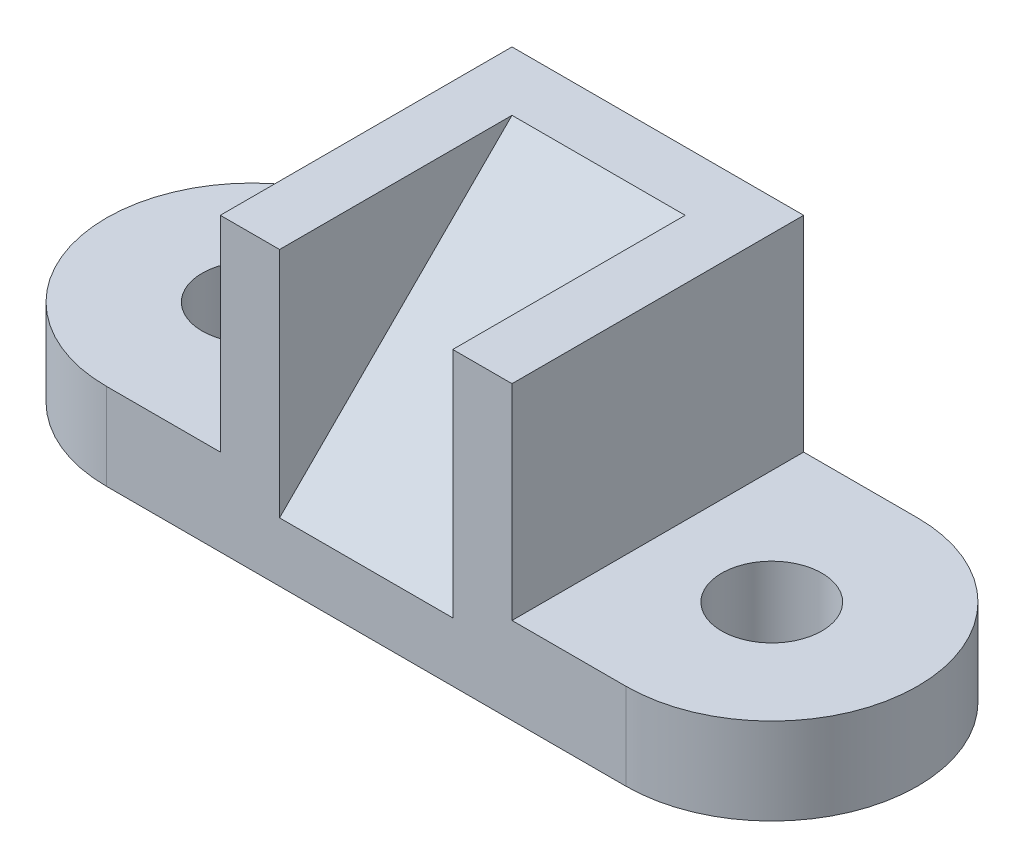
ISO-10303-21;
HEADER;
FILE_DESCRIPTION(('STEP AP214'),'2;1');
FILE_NAME('part.step','',(''),(''),'','','');
FILE_SCHEMA(('AUTOMOTIVE_DESIGN { 1 0 10303 214 1 1 1 1 }'));
ENDSEC;
DATA;
#1=APPLICATION_CONTEXT('core data for automotive mechanical design processes');
#2=APPLICATION_PROTOCOL_DEFINITION('international standard','automotive_design',2000,#1);
#3=PRODUCT_CONTEXT('',#1,'mechanical');
#4=PRODUCT('Part','Part','',(#3));
#5=PRODUCT_RELATED_PRODUCT_CATEGORY('part','',(#4));
#6=PRODUCT_DEFINITION_FORMATION('','',#4);
#7=PRODUCT_DEFINITION_CONTEXT('part definition',#1,'design');
#8=PRODUCT_DEFINITION('design','',#6,#7);
#9=PRODUCT_DEFINITION_SHAPE('','',#8);
#10=(LENGTH_UNIT() NAMED_UNIT(*) SI_UNIT(.MILLI.,.METRE.));
#11=(NAMED_UNIT(*) PLANE_ANGLE_UNIT() SI_UNIT($,.RADIAN.));
#12=(NAMED_UNIT(*) SI_UNIT($,.STERADIAN.) SOLID_ANGLE_UNIT());
#13=UNCERTAINTY_MEASURE_WITH_UNIT(LENGTH_MEASURE(1.E-05),#10,'distance_accuracy_value','');
#14=(GEOMETRIC_REPRESENTATION_CONTEXT(3) GLOBAL_UNCERTAINTY_ASSIGNED_CONTEXT((#13)) GLOBAL_UNIT_ASSIGNED_CONTEXT((#10,
#11,#12)) REPRESENTATION_CONTEXT('',''));
#15=CARTESIAN_POINT('',(0.,0.,0.));
#16=DIRECTION('',(0.,0.,1.));
#17=DIRECTION('',(1.,0.,0.));
#18=AXIS2_PLACEMENT_3D('',#15,#16,#17);
#19=CARTESIAN_POINT('',(0.,19.,0.));
#20=DIRECTION('',(0.,0.,-1.));
#21=DIRECTION('',(-1.,0.,0.));
#22=AXIS2_PLACEMENT_3D('',#19,#20,#21);
#23=PLANE('',#22);
#24=DIRECTION('',(0.,1.,0.));
#25=VECTOR('',#24,1.);
#26=CARTESIAN_POINT('',(76.,13.,0.));
#27=LINE('',#26,#25);
#28=CARTESIAN_POINT('',(76.,13.,0.));
#29=VERTEX_POINT('',#28);
#30=CARTESIAN_POINT('',(76.,64.,0.));
#31=VERTEX_POINT('',#30);
#32=EDGE_CURVE('E132',#29,#31,#27,.T.);
#33=ORIENTED_EDGE('',*,*,#32,.F.);
#34=DIRECTION('',(-1.,0.,0.));
#35=VECTOR('',#34,1.);
#36=CARTESIAN_POINT('',(76.,13.,0.));
#37=LINE('',#36,#35);
#38=CARTESIAN_POINT('',(38.,13.,0.));
#39=VERTEX_POINT('',#38);
#40=EDGE_CURVE('E119',#29,#39,#37,.T.);
#41=ORIENTED_EDGE('',*,*,#40,.T.);
#42=DIRECTION('',(0.,1.,0.));
#43=VECTOR('',#42,1.);
#44=CARTESIAN_POINT('',(38.,13.,0.));
#45=LINE('',#44,#43);
#46=CARTESIAN_POINT('',(38.,64.,0.));
#47=VERTEX_POINT('',#46);
#48=EDGE_CURVE('E144',#39,#47,#45,.T.);
#49=ORIENTED_EDGE('',*,*,#48,.T.);
#50=DIRECTION('',(1.,0.,0.));
#51=VECTOR('',#50,1.);
#52=CARTESIAN_POINT('',(89.,64.,0.));
#53=LINE('',#52,#51);
#54=CARTESIAN_POINT('',(25.,64.,0.));
#55=VERTEX_POINT('',#54);
#56=EDGE_CURVE('E153',#55,#47,#53,.T.);
#57=ORIENTED_EDGE('',*,*,#56,.F.);
#58=DIRECTION('',(0.,-1.,0.));
#59=VECTOR('',#58,1.);
#60=CARTESIAN_POINT('',(25.,64.,0.));
#61=LINE('',#60,#59);
#62=CARTESIAN_POINT('',(25.,19.,0.));
#63=VERTEX_POINT('',#62);
#64=EDGE_CURVE('E172',#55,#63,#61,.T.);
#65=ORIENTED_EDGE('',*,*,#64,.T.);
#66=DIRECTION('',(1.,0.,0.));
#67=VECTOR('',#66,1.);
#68=CARTESIAN_POINT('',(0.,19.,0.));
#69=LINE('',#68,#67);
#70=CARTESIAN_POINT('',(0.,19.,0.));
#71=VERTEX_POINT('',#70);
#72=EDGE_CURVE('E193',#71,#63,#69,.T.);
#73=ORIENTED_EDGE('',*,*,#72,.F.);
#74=DIRECTION('',(0.,-1.,0.));
#75=VECTOR('',#74,1.);
#76=CARTESIAN_POINT('',(0.,19.,0.));
#77=LINE('',#76,#75);
#78=CARTESIAN_POINT('',(0.,0.,0.));
#79=VERTEX_POINT('',#78);
#80=EDGE_CURVE('E11',#71,#79,#77,.T.);
#81=ORIENTED_EDGE('',*,*,#80,.T.);
#82=DIRECTION('',(1.,0.,0.));
#83=VECTOR('',#82,1.);
#84=CARTESIAN_POINT('',(0.,0.,0.));
#85=LINE('',#84,#83);
#86=CARTESIAN_POINT('',(114.,0.,0.));
#87=VERTEX_POINT('',#86);
#88=EDGE_CURVE('E203',#79,#87,#85,.T.);
#89=ORIENTED_EDGE('',*,*,#88,.T.);
#90=DIRECTION('',(0.,-1.,0.));
#91=VECTOR('',#90,1.);
#92=CARTESIAN_POINT('',(114.,19.,0.));
#93=LINE('',#92,#91);
#94=CARTESIAN_POINT('',(114.,19.,0.));
#95=VERTEX_POINT('',#94);
#96=EDGE_CURVE('E45',#95,#87,#93,.T.);
#97=ORIENTED_EDGE('',*,*,#96,.F.);
#98=CARTESIAN_POINT('',(89.,19.,0.));
#99=VERTEX_POINT('',#98);
#100=EDGE_CURVE('E191',#99,#95,#69,.T.);
#101=ORIENTED_EDGE('',*,*,#100,.F.);
#102=DIRECTION('',(0.,-1.,0.));
#103=VECTOR('',#102,1.);
#104=CARTESIAN_POINT('',(89.,64.,0.));
#105=LINE('',#104,#103);
#106=CARTESIAN_POINT('',(89.,64.,0.));
#107=VERTEX_POINT('',#106);
#108=EDGE_CURVE('E169',#107,#99,#105,.T.);
#109=ORIENTED_EDGE('',*,*,#108,.F.);
#110=EDGE_CURVE('E139',#31,#107,#53,.T.);
#111=ORIENTED_EDGE('',*,*,#110,.F.);
#112=EDGE_LOOP('',(#33,#41,#49,#57,#65,#73,#81,#89,#97,#101,#109,#111));
#113=FACE_BOUND('',#112,.T.);
#114=ADVANCED_FACE('F37',(#113),#23,.F.);
#115=CARTESIAN_POINT('',(0.,64.,0.));
#116=DIRECTION('',(0.,-1.,0.));
#117=DIRECTION('',(0.,0.,-1.));
#118=AXIS2_PLACEMENT_3D('',#115,#116,#117);
#119=PLANE('',#118);
#120=DIRECTION('',(0.,0.,-1.));
#121=VECTOR('',#120,1.);
#122=CARTESIAN_POINT('',(76.,64.,0.));
#123=LINE('',#122,#121);
#124=CARTESIAN_POINT('',(76.,64.,-51.));
#125=VERTEX_POINT('',#124);
#126=EDGE_CURVE('E128',#31,#125,#123,.T.);
#127=ORIENTED_EDGE('',*,*,#126,.F.);
#128=ORIENTED_EDGE('',*,*,#110,.T.);
#129=DIRECTION('',(0.,0.,-1.));
#130=VECTOR('',#129,1.);
#131=CARTESIAN_POINT('',(89.,64.,-64.));
#132=LINE('',#131,#130);
#133=CARTESIAN_POINT('',(89.,64.,-64.));
#134=VERTEX_POINT('',#133);
#135=EDGE_CURVE('E156',#107,#134,#132,.T.);
#136=ORIENTED_EDGE('',*,*,#135,.T.);
#137=DIRECTION('',(-1.,0.,0.));
#138=VECTOR('',#137,1.);
#139=CARTESIAN_POINT('',(89.,64.,-64.));
#140=LINE('',#139,#138);
#141=CARTESIAN_POINT('',(25.,64.,-64.));
#142=VERTEX_POINT('',#141);
#143=EDGE_CURVE('E158',#134,#142,#140,.T.);
#144=ORIENTED_EDGE('',*,*,#143,.T.);
#145=DIRECTION('',(0.,0.,1.));
#146=VECTOR('',#145,1.);
#147=CARTESIAN_POINT('',(25.,64.,-64.));
#148=LINE('',#147,#146);
#149=EDGE_CURVE('E149',#142,#55,#148,.T.);
#150=ORIENTED_EDGE('',*,*,#149,.T.);
#151=ORIENTED_EDGE('',*,*,#56,.T.);
#152=DIRECTION('',(0.,0.,-1.));
#153=VECTOR('',#152,1.);
#154=CARTESIAN_POINT('',(38.,64.,0.));
#155=LINE('',#154,#153);
#156=CARTESIAN_POINT('',(38.,64.,-51.));
#157=VERTEX_POINT('',#156);
#158=EDGE_CURVE('E135',#47,#157,#155,.T.);
#159=ORIENTED_EDGE('',*,*,#158,.T.);
#160=DIRECTION('',(-1.,0.,0.));
#161=VECTOR('',#160,1.);
#162=CARTESIAN_POINT('',(76.,64.,-51.));
#163=LINE('',#162,#161);
#164=EDGE_CURVE('E127',#125,#157,#163,.T.);
#165=ORIENTED_EDGE('',*,*,#164,.F.);
#166=EDGE_LOOP('',(#127,#128,#136,#144,#150,#151,#159,#165));
#167=FACE_BOUND('',#166,.T.);
#168=ADVANCED_FACE('F241',(#167),#119,.F.);
#169=CARTESIAN_POINT('',(0.,19.,-32.));
#170=DIRECTION('',(0.,1.,0.));
#171=DIRECTION('',(0.,0.,1.));
#172=AXIS2_PLACEMENT_3D('',#169,#170,#171);
#173=PLANE('',#172);
#174=DIRECTION('',(0.,0.,1.));
#175=VECTOR('',#174,1.);
#176=CARTESIAN_POINT('',(25.,19.,-64.));
#177=LINE('',#176,#175);
#178=CARTESIAN_POINT('',(25.,19.,-64.));
#179=VERTEX_POINT('',#178);
#180=EDGE_CURVE('E60',#179,#63,#177,.T.);
#181=ORIENTED_EDGE('',*,*,#180,.F.);
#182=DIRECTION('',(-1.,0.,0.));
#183=VECTOR('',#182,1.);
#184=CARTESIAN_POINT('',(0.,19.,-64.));
#185=LINE('',#184,#183);
#186=CARTESIAN_POINT('',(0.,19.,-64.));
#187=VERTEX_POINT('',#186);
#188=EDGE_CURVE('E197',#179,#187,#185,.T.);
#189=ORIENTED_EDGE('',*,*,#188,.T.);
#190=CARTESIAN_POINT('',(0.,19.,-32.));
#191=DIRECTION('',(0.,1.,0.));
#192=DIRECTION('',(0.,0.,1.));
#193=AXIS2_PLACEMENT_3D('',#190,#191,#192);
#194=CIRCLE('',#193,32.);
#195=EDGE_CURVE('E188',#187,#71,#194,.T.);
#196=ORIENTED_EDGE('',*,*,#195,.T.);
#197=ORIENTED_EDGE('',*,*,#72,.T.);
#198=EDGE_LOOP('',(#181,#189,#196,#197));
#199=FACE_BOUND('',#198,.T.);
#200=CARTESIAN_POINT('',(0.,19.,-32.));
#201=DIRECTION('',(0.,1.,0.));
#202=DIRECTION('',(0.,0.,1.));
#203=AXIS2_PLACEMENT_3D('',#200,#201,#202);
#204=CIRCLE('',#203,11.);
#205=CARTESIAN_POINT('',(0.,19.,-21.));
#206=VERTEX_POINT('',#205);
#207=EDGE_CURVE('E182',#206,#206,#204,.T.);
#208=ORIENTED_EDGE('',*,*,#207,.F.);
#209=EDGE_LOOP('',(#208));
#210=FACE_BOUND('',#209,.T.);
#211=ADVANCED_FACE('F232',(#199,#210),#173,.T.);
#212=DIRECTION('',(0.,0.,-1.));
#213=VECTOR('',#212,1.);
#214=CARTESIAN_POINT('',(89.,19.,-64.));
#215=LINE('',#214,#213);
#216=CARTESIAN_POINT('',(89.,19.,-64.));
#217=VERTEX_POINT('',#216);
#218=EDGE_CURVE('E152',#99,#217,#215,.T.);
#219=ORIENTED_EDGE('',*,*,#218,.F.);
#220=ORIENTED_EDGE('',*,*,#100,.T.);
#221=CARTESIAN_POINT('',(114.,19.,-32.));
#222=DIRECTION('',(0.,1.,0.));
#223=DIRECTION('',(0.,0.,1.));
#224=AXIS2_PLACEMENT_3D('',#221,#222,#223);
#225=CIRCLE('',#224,32.);
#226=CARTESIAN_POINT('',(114.,19.,-64.));
#227=VERTEX_POINT('',#226);
#228=EDGE_CURVE('E195',#95,#227,#225,.T.);
#229=ORIENTED_EDGE('',*,*,#228,.T.);
#230=EDGE_CURVE('E198',#227,#217,#185,.T.);
#231=ORIENTED_EDGE('',*,*,#230,.T.);
#232=EDGE_LOOP('',(#219,#220,#229,#231));
#233=FACE_BOUND('',#232,.T.);
#234=CARTESIAN_POINT('',(114.,19.,-32.));
#235=DIRECTION('',(0.,1.,0.));
#236=DIRECTION('',(0.,0.,1.));
#237=AXIS2_PLACEMENT_3D('',#234,#235,#236);
#238=CIRCLE('',#237,11.);
#239=CARTESIAN_POINT('',(114.,19.,-21.));
#240=VERTEX_POINT('',#239);
#241=EDGE_CURVE('E176',#240,#240,#238,.T.);
#242=ORIENTED_EDGE('',*,*,#241,.F.);
#243=EDGE_LOOP('',(#242));
#244=FACE_BOUND('',#243,.T.);
#245=ADVANCED_FACE('F247',(#233,#244),#173,.T.);
#246=CARTESIAN_POINT('',(0.,0.,-32.));
#247=DIRECTION('',(0.,1.,0.));
#248=DIRECTION('',(0.,0.,1.));
#249=AXIS2_PLACEMENT_3D('',#246,#247,#248);
#250=PLANE('',#249);
#251=CARTESIAN_POINT('',(0.,0.,-32.));
#252=DIRECTION('',(0.,1.,0.));
#253=DIRECTION('',(0.,0.,1.));
#254=AXIS2_PLACEMENT_3D('',#251,#252,#253);
#255=CIRCLE('',#254,32.);
#256=CARTESIAN_POINT('',(0.,0.,-64.));
#257=VERTEX_POINT('',#256);
#258=EDGE_CURVE('E185',#257,#79,#255,.T.);
#259=ORIENTED_EDGE('',*,*,#258,.F.);
#260=DIRECTION('',(-1.,0.,0.));
#261=VECTOR('',#260,1.);
#262=CARTESIAN_POINT('',(0.,0.,-64.));
#263=LINE('',#262,#261);
#264=CARTESIAN_POINT('',(114.,0.,-64.));
#265=VERTEX_POINT('',#264);
#266=EDGE_CURVE('E192',#265,#257,#263,.T.);
#267=ORIENTED_EDGE('',*,*,#266,.F.);
#268=CARTESIAN_POINT('',(114.,0.,-32.));
#269=DIRECTION('',(0.,1.,0.));
#270=DIRECTION('',(0.,0.,1.));
#271=AXIS2_PLACEMENT_3D('',#268,#269,#270);
#272=CIRCLE('',#271,32.);
#273=EDGE_CURVE('E205',#87,#265,#272,.T.);
#274=ORIENTED_EDGE('',*,*,#273,.F.);
#275=ORIENTED_EDGE('',*,*,#88,.F.);
#276=EDGE_LOOP('',(#259,#267,#274,#275));
#277=FACE_BOUND('',#276,.T.);
#278=CARTESIAN_POINT('',(0.,0.,-32.));
#279=DIRECTION('',(0.,1.,0.));
#280=DIRECTION('',(0.,0.,1.));
#281=AXIS2_PLACEMENT_3D('',#278,#279,#280);
#282=CIRCLE('',#281,11.);
#283=CARTESIAN_POINT('',(0.,0.,-21.));
#284=VERTEX_POINT('',#283);
#285=EDGE_CURVE('E179',#284,#284,#282,.T.);
#286=ORIENTED_EDGE('',*,*,#285,.T.);
#287=EDGE_LOOP('',(#286));
#288=FACE_BOUND('',#287,.T.);
#289=CARTESIAN_POINT('',(114.,0.,-32.));
#290=DIRECTION('',(0.,1.,0.));
#291=DIRECTION('',(0.,0.,1.));
#292=AXIS2_PLACEMENT_3D('',#289,#290,#291);
#293=CIRCLE('',#292,11.);
#294=CARTESIAN_POINT('',(114.,0.,-21.));
#295=VERTEX_POINT('',#294);
#296=EDGE_CURVE('E175',#295,#295,#293,.T.);
#297=ORIENTED_EDGE('',*,*,#296,.T.);
#298=EDGE_LOOP('',(#297));
#299=FACE_BOUND('',#298,.T.);
#300=ADVANCED_FACE('F223',(#277,#288,#299),#250,.F.);
#301=CARTESIAN_POINT('',(0.,19.,-32.));
#302=DIRECTION('',(0.,-1.,0.));
#303=DIRECTION('',(0.,0.,-1.));
#304=AXIS2_PLACEMENT_3D('',#301,#302,#303);
#305=CYLINDRICAL_SURFACE('',#304,32.);
#306=ORIENTED_EDGE('',*,*,#258,.T.);
#307=ORIENTED_EDGE('',*,*,#80,.F.);
#308=ORIENTED_EDGE('',*,*,#195,.F.);
#309=DIRECTION('',(0.,-1.,0.));
#310=VECTOR('',#309,1.);
#311=CARTESIAN_POINT('',(0.,19.,-64.));
#312=LINE('',#311,#310);
#313=EDGE_CURVE('E200',#187,#257,#312,.T.);
#314=ORIENTED_EDGE('',*,*,#313,.T.);
#315=EDGE_LOOP('',(#306,#307,#308,#314));
#316=FACE_BOUND('',#315,.T.);
#317=ADVANCED_FACE('F39',(#316),#305,.T.);
#318=CARTESIAN_POINT('',(114.,19.,-32.));
#319=DIRECTION('',(0.,-1.,0.));
#320=DIRECTION('',(0.,0.,-1.));
#321=AXIS2_PLACEMENT_3D('',#318,#319,#320);
#322=CYLINDRICAL_SURFACE('',#321,32.);
#323=ORIENTED_EDGE('',*,*,#273,.T.);
#324=DIRECTION('',(0.,-1.,0.));
#325=VECTOR('',#324,1.);
#326=CARTESIAN_POINT('',(114.,19.,-64.));
#327=LINE('',#326,#325);
#328=EDGE_CURVE('E210',#227,#265,#327,.T.);
#329=ORIENTED_EDGE('',*,*,#328,.F.);
#330=ORIENTED_EDGE('',*,*,#228,.F.);
#331=ORIENTED_EDGE('',*,*,#96,.T.);
#332=EDGE_LOOP('',(#323,#329,#330,#331));
#333=FACE_BOUND('',#332,.T.);
#334=ADVANCED_FACE('F217',(#333),#322,.T.);
#335=CARTESIAN_POINT('',(0.,19.,-64.));
#336=DIRECTION('',(0.,0.,1.));
#337=DIRECTION('',(1.,0.,0.));
#338=AXIS2_PLACEMENT_3D('',#335,#336,#337);
#339=PLANE('',#338);
#340=ORIENTED_EDGE('',*,*,#266,.T.);
#341=ORIENTED_EDGE('',*,*,#313,.F.);
#342=ORIENTED_EDGE('',*,*,#188,.F.);
#343=DIRECTION('',(0.,-1.,0.));
#344=VECTOR('',#343,1.);
#345=CARTESIAN_POINT('',(25.,64.,-64.));
#346=LINE('',#345,#344);
#347=EDGE_CURVE('E160',#142,#179,#346,.T.);
#348=ORIENTED_EDGE('',*,*,#347,.F.);
#349=ORIENTED_EDGE('',*,*,#143,.F.);
#350=DIRECTION('',(0.,-1.,0.));
#351=VECTOR('',#350,1.);
#352=CARTESIAN_POINT('',(89.,64.,-64.));
#353=LINE('',#352,#351);
#354=EDGE_CURVE('E166',#134,#217,#353,.T.);
#355=ORIENTED_EDGE('',*,*,#354,.T.);
#356=ORIENTED_EDGE('',*,*,#230,.F.);
#357=ORIENTED_EDGE('',*,*,#328,.T.);
#358=EDGE_LOOP('',(#340,#341,#342,#348,#349,#355,#356,#357));
#359=FACE_BOUND('',#358,.T.);
#360=ADVANCED_FACE('F227',(#359),#339,.F.);
#361=CARTESIAN_POINT('',(0.,19.,-32.));
#362=DIRECTION('',(0.,-1.,0.));
#363=DIRECTION('',(0.,0.,-1.));
#364=AXIS2_PLACEMENT_3D('',#361,#362,#363);
#365=CYLINDRICAL_SURFACE('',#364,11.);
#366=ORIENTED_EDGE('',*,*,#207,.T.);
#367=EDGE_LOOP('',(#366));
#368=FACE_BOUND('',#367,.T.);
#369=ORIENTED_EDGE('',*,*,#285,.F.);
#370=EDGE_LOOP('',(#369));
#371=FACE_BOUND('',#370,.T.);
#372=ADVANCED_FACE('F256',(#368,#371),#365,.F.);
#373=CARTESIAN_POINT('',(114.,19.,-32.));
#374=DIRECTION('',(0.,-1.,0.));
#375=DIRECTION('',(0.,0.,-1.));
#376=AXIS2_PLACEMENT_3D('',#373,#374,#375);
#377=CYLINDRICAL_SURFACE('',#376,11.);
#378=ORIENTED_EDGE('',*,*,#241,.T.);
#379=EDGE_LOOP('',(#378));
#380=FACE_BOUND('',#379,.T.);
#381=ORIENTED_EDGE('',*,*,#296,.F.);
#382=EDGE_LOOP('',(#381));
#383=FACE_BOUND('',#382,.T.);
#384=ADVANCED_FACE('F253',(#380,#383),#377,.F.);
#385=CARTESIAN_POINT('',(25.,64.,-64.));
#386=DIRECTION('',(1.,0.,0.));
#387=DIRECTION('',(0.,0.,-1.));
#388=AXIS2_PLACEMENT_3D('',#385,#386,#387);
#389=PLANE('',#388);
#390=ORIENTED_EDGE('',*,*,#180,.T.);
#391=ORIENTED_EDGE('',*,*,#64,.F.);
#392=ORIENTED_EDGE('',*,*,#149,.F.);
#393=ORIENTED_EDGE('',*,*,#347,.T.);
#394=EDGE_LOOP('',(#390,#391,#392,#393));
#395=FACE_BOUND('',#394,.T.);
#396=ADVANCED_FACE('F238',(#395),#389,.F.);
#397=CARTESIAN_POINT('',(89.,64.,-64.));
#398=DIRECTION('',(-1.,0.,0.));
#399=DIRECTION('',(0.,0.,1.));
#400=AXIS2_PLACEMENT_3D('',#397,#398,#399);
#401=PLANE('',#400);
#402=ORIENTED_EDGE('',*,*,#218,.T.);
#403=ORIENTED_EDGE('',*,*,#354,.F.);
#404=ORIENTED_EDGE('',*,*,#135,.F.);
#405=ORIENTED_EDGE('',*,*,#108,.T.);
#406=EDGE_LOOP('',(#402,#403,#404,#405));
#407=FACE_BOUND('',#406,.T.);
#408=ADVANCED_FACE('F245',(#407),#401,.F.);
#409=CARTESIAN_POINT('',(76.,64.,-51.));
#410=DIRECTION('',(0.,-0.707106781186548,-0.707106781186547));
#411=DIRECTION('',(0.,0.707106781186547,-0.707106781186548));
#412=AXIS2_PLACEMENT_3D('',#409,#410,#411);
#413=PLANE('',#412);
#414=DIRECTION('',(0.,-0.707106781186547,0.707106781186548));
#415=VECTOR('',#414,1.);
#416=CARTESIAN_POINT('',(38.,64.,-51.));
#417=LINE('',#416,#415);
#418=EDGE_CURVE('E52',#157,#39,#417,.T.);
#419=ORIENTED_EDGE('',*,*,#418,.T.);
#420=ORIENTED_EDGE('',*,*,#40,.F.);
#421=DIRECTION('',(0.,-0.707106781186547,0.707106781186548));
#422=VECTOR('',#421,1.);
#423=CARTESIAN_POINT('',(76.,64.,-51.));
#424=LINE('',#423,#422);
#425=EDGE_CURVE('E122',#125,#29,#424,.T.);
#426=ORIENTED_EDGE('',*,*,#425,.F.);
#427=ORIENTED_EDGE('',*,*,#164,.T.);
#428=EDGE_LOOP('',(#419,#420,#426,#427));
#429=FACE_BOUND('',#428,.T.);
#430=ADVANCED_FACE('F121',(#429),#413,.F.);
#431=CARTESIAN_POINT('',(76.,0.,0.));
#432=DIRECTION('',(-1.,0.,0.));
#433=DIRECTION('',(0.,0.,1.));
#434=AXIS2_PLACEMENT_3D('',#431,#432,#433);
#435=PLANE('',#434);
#436=ORIENTED_EDGE('',*,*,#425,.T.);
#437=ORIENTED_EDGE('',*,*,#32,.T.);
#438=ORIENTED_EDGE('',*,*,#126,.T.);
#439=EDGE_LOOP('',(#436,#437,#438));
#440=FACE_BOUND('',#439,.T.);
#441=ADVANCED_FACE('F131',(#440),#435,.T.);
#442=CARTESIAN_POINT('',(38.,0.,0.));
#443=DIRECTION('',(-1.,0.,0.));
#444=DIRECTION('',(0.,0.,1.));
#445=AXIS2_PLACEMENT_3D('',#442,#443,#444);
#446=PLANE('',#445);
#447=ORIENTED_EDGE('',*,*,#418,.F.);
#448=ORIENTED_EDGE('',*,*,#158,.F.);
#449=ORIENTED_EDGE('',*,*,#48,.F.);
#450=EDGE_LOOP('',(#447,#448,#449));
#451=FACE_BOUND('',#450,.T.);
#452=ADVANCED_FACE('F289',(#451),#446,.F.);
#453=CLOSED_SHELL('',(#114,#168,#211,#245,#300,#317,#334,#360,#372,#384,#396,#408,#430,#441,#452));
#454=MANIFOLD_SOLID_BREP('B2',#453);
#455=ADVANCED_BREP_SHAPE_REPRESENTATION('',(#18,#454),#14);
#456=SHAPE_DEFINITION_REPRESENTATION(#9,#455);
ENDSEC;
END-ISO-10303-21;
